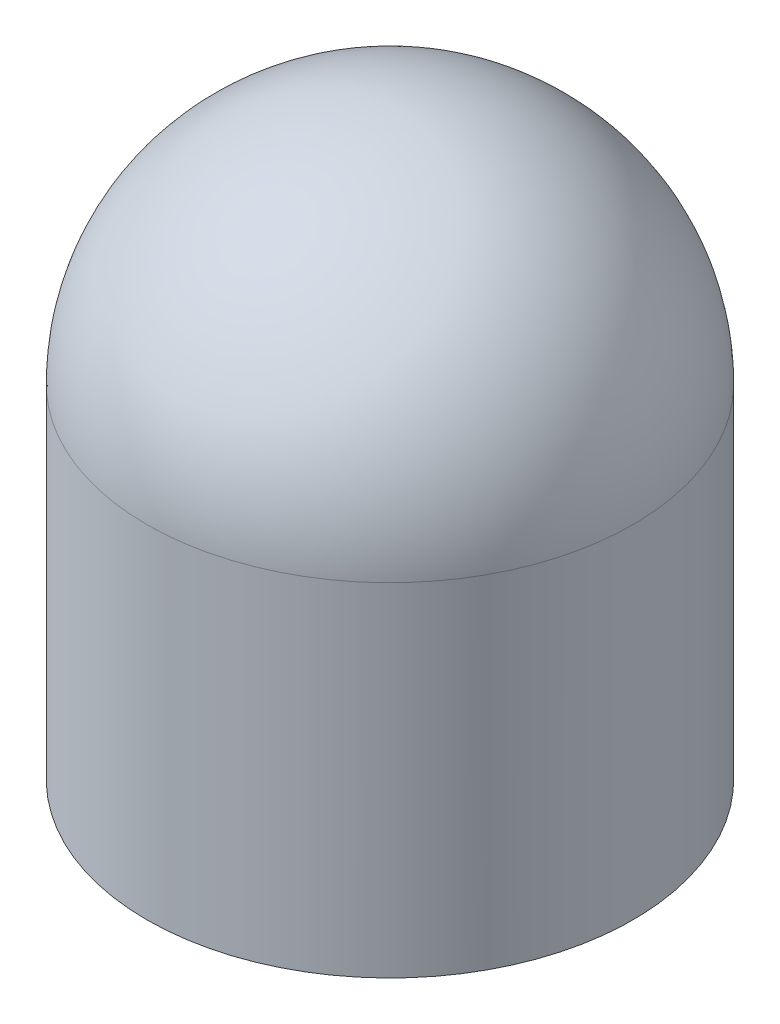
ISO-10303-21;
HEADER;
FILE_DESCRIPTION(('STEP AP214'),'2;1');
FILE_NAME('part.step','',(''),(''),'','','');
FILE_SCHEMA(('AUTOMOTIVE_DESIGN { 1 0 10303 214 1 1 1 1 }'));
ENDSEC;
DATA;
#1=APPLICATION_CONTEXT('core data for automotive mechanical design processes');
#2=APPLICATION_PROTOCOL_DEFINITION('international standard','automotive_design',2000,#1);
#3=PRODUCT_CONTEXT('',#1,'mechanical');
#4=PRODUCT('Part','Part','',(#3));
#5=PRODUCT_RELATED_PRODUCT_CATEGORY('part','',(#4));
#6=PRODUCT_DEFINITION_FORMATION('','',#4);
#7=PRODUCT_DEFINITION_CONTEXT('part definition',#1,'design');
#8=PRODUCT_DEFINITION('design','',#6,#7);
#9=PRODUCT_DEFINITION_SHAPE('','',#8);
#10=(LENGTH_UNIT() NAMED_UNIT(*) SI_UNIT(.MILLI.,.METRE.));
#11=(NAMED_UNIT(*) PLANE_ANGLE_UNIT() SI_UNIT($,.RADIAN.));
#12=(NAMED_UNIT(*) SI_UNIT($,.STERADIAN.) SOLID_ANGLE_UNIT());
#13=UNCERTAINTY_MEASURE_WITH_UNIT(LENGTH_MEASURE(1.E-05),#10,'distance_accuracy_value','');
#14=(GEOMETRIC_REPRESENTATION_CONTEXT(3) GLOBAL_UNCERTAINTY_ASSIGNED_CONTEXT((#13)) GLOBAL_UNIT_ASSIGNED_CONTEXT((#10,
#11,#12)) REPRESENTATION_CONTEXT('',''));
#15=CARTESIAN_POINT('',(0.,0.,0.));
#16=DIRECTION('',(0.,0.,1.));
#17=DIRECTION('',(1.,0.,0.));
#18=AXIS2_PLACEMENT_3D('',#15,#16,#17);
#19=CARTESIAN_POINT('',(1.55431223447522E-12,10.4000000000001,3.5527136788005E-12));
#20=DIRECTION('',(0.,1.,0.));
#21=DIRECTION('',(0.,0.,1.));
#22=AXIS2_PLACEMENT_3D('',#19,#20,#21);
#23=CYLINDRICAL_SURFACE('',#22,10.65);
#24=CARTESIAN_POINT('',(-4.44089209850063E-13,-15.,4.21884749357559E-12));
#25=DIRECTION('',(0.,1.,0.));
#26=DIRECTION('',(0.,0.,1.));
#27=AXIS2_PLACEMENT_3D('',#24,#25,#26);
#28=CIRCLE('',#27,10.65);
#29=CARTESIAN_POINT('',(-4.4349801608945E-13,-15.,10.6500000000042));
#30=VERTEX_POINT('',#29);
#31=EDGE_CURVE('E70',#30,#30,#28,.T.);
#32=ORIENTED_EDGE('',*,*,#31,.T.);
#33=EDGE_LOOP('',(#32));
#34=FACE_BOUND('',#33,.T.);
#35=CARTESIAN_POINT('',(0.,0.,0.));
#36=DIRECTION('',(0.,1.,0.));
#37=DIRECTION('',(0.,0.,1.));
#38=AXIS2_PLACEMENT_3D('',#35,#36,#37);
#39=CIRCLE('',#38,10.65);
#40=CARTESIAN_POINT('',(0.,0.,10.65));
#41=VERTEX_POINT('',#40);
#42=EDGE_CURVE('E11',#41,#41,#39,.T.);
#43=ORIENTED_EDGE('',*,*,#42,.F.);
#44=EDGE_LOOP('',(#43));
#45=FACE_BOUND('',#44,.T.);
#46=ADVANCED_FACE('F34',(#34,#45),#23,.T.);
#47=CARTESIAN_POINT('',(0.,0.,0.));
#48=DIRECTION('',(0.,0.,1.));
#49=DIRECTION('',(-0.999999999999999,0.,0.));
#50=AXIS2_PLACEMENT_3D('',#47,#48,#49);
#51=ELLIPSE('',#50,10.65,10.4);
#52=TRIMMED_CURVE('',#51,(PARAMETER_VALUE(4.71238898038469)),
(PARAMETER_VALUE(7.85398163397448)),.T.,.PARAMETER.);
#53=CARTESIAN_POINT('',(1.55431223447522E-12,10.4000000000001,3.5527136788005E-12));
#54=DIRECTION('',(0.,1.,0.));
#55=AXIS1_PLACEMENT('',#53,#54);
#56=SURFACE_OF_REVOLUTION('',#52,#55);
#57=ORIENTED_EDGE('',*,*,#42,.T.);
#58=EDGE_LOOP('',(#57));
#59=FACE_BOUND('',#58,.T.);
#60=CARTESIAN_POINT('',(1.55431223447522E-12,10.4000000000001,3.5527136788005E-12));
#61=VERTEX_POINT('',#60);
#62=VERTEX_LOOP('',#61);
#63=FACE_BOUND('',#62,.T.);
#64=ADVANCED_FACE('F50',(#59,#63),#56,.F.);
#65=CARTESIAN_POINT('',(1.55431223447522E-12,7.59999999999995,3.99680288865056E-12));
#66=CARTESIAN_POINT('',(-1.03616633286063,7.60000000000012,3.77475828372553E-12));
#67=CARTESIAN_POINT('',(-2.07175097106416,7.39849161421469,3.77475828372553E-12));
#68=CARTESIAN_POINT('',(-3.97953854376332,6.62681016237533,4.66293670342566E-12));
#69=CARTESIAN_POINT('',(-4.85082950111582,6.05726333308616,3.77475828372553E-12));
#70=CARTESIAN_POINT('',(-6.29805136363437,4.64401381476007,4.21884749357559E-12));
#71=CARTESIAN_POINT('',(-6.87365650737926,3.80116868313676,6.66133814775094E-13));
#72=CARTESIAN_POINT('',(-7.64958647302683,1.97188129123535,-8.88178419700125E-13));
#73=CARTESIAN_POINT('',(-7.85000000000213,0.98602711731674,0.));
#74=CARTESIAN_POINT('',(-7.8500000000008,0.,6.66133814775094E-13));
#75=B_SPLINE_CURVE_WITH_KNOTS('',3,(#65,#66,#67,#68,#69,#70,#71,#72,#73,#74),.UNSPECIFIED.,.F.,
.F.,(4,2,2,2,4),(0.,0.25,0.5,0.75,1.),.UNSPECIFIED.);
#76=CARTESIAN_POINT('',(1.55431223447522E-12,10.4000000000001,3.5527136788005E-12));
#77=DIRECTION('',(0.,1.,0.));
#78=AXIS1_PLACEMENT('',#76,#77);
#79=SURFACE_OF_REVOLUTION('',#75,#78);
#80=CARTESIAN_POINT('',(0.,0.,0.));
#81=DIRECTION('',(0.,1.,0.));
#82=DIRECTION('',(0.,0.,1.));
#83=AXIS2_PLACEMENT_3D('',#80,#81,#82);
#84=CIRCLE('',#83,7.85);
#85=CARTESIAN_POINT('',(0.,0.,7.85000000000002));
#86=VERTEX_POINT('',#85);
#87=EDGE_CURVE('E41',#86,#86,#84,.T.);
#88=ORIENTED_EDGE('',*,*,#87,.F.);
#89=EDGE_LOOP('',(#88));
#90=FACE_BOUND('',#89,.T.);
#91=CARTESIAN_POINT('',(1.55431223447522E-12,7.59999999999995,3.99680288865056E-12));
#92=VERTEX_POINT('',#91);
#93=VERTEX_LOOP('',#92);
#94=FACE_BOUND('',#93,.T.);
#95=ADVANCED_FACE('F47',(#90,#94),#79,.T.);
#96=CARTESIAN_POINT('',(1.55431223447522E-12,10.4000000000001,3.5527136788005E-12));
#97=DIRECTION('',(0.,1.,0.));
#98=DIRECTION('',(0.,0.,1.));
#99=AXIS2_PLACEMENT_3D('',#96,#97,#98);
#100=CYLINDRICAL_SURFACE('',#99,7.85);
#101=CARTESIAN_POINT('',(-4.44089209850063E-13,-15.,4.21884749357559E-12));
#102=DIRECTION('',(0.,1.,0.));
#103=DIRECTION('',(0.,0.,1.));
#104=AXIS2_PLACEMENT_3D('',#101,#102,#103);
#105=CIRCLE('',#104,7.85);
#106=CARTESIAN_POINT('',(-4.43653447312897E-13,-15.,7.85000000000424));
#107=VERTEX_POINT('',#106);
#108=EDGE_CURVE('E73',#107,#107,#105,.T.);
#109=ORIENTED_EDGE('',*,*,#108,.F.);
#110=EDGE_LOOP('',(#109));
#111=FACE_BOUND('',#110,.T.);
#112=ORIENTED_EDGE('',*,*,#87,.T.);
#113=EDGE_LOOP('',(#112));
#114=FACE_BOUND('',#113,.T.);
#115=ADVANCED_FACE('F49',(#111,#114),#100,.F.);
#116=CARTESIAN_POINT('',(-7.85000000000124,-14.9999999999999,4.66293670342566E-12));
#117=DIRECTION('',(0.,1.,0.));
#118=DIRECTION('',(0.,0.,1.));
#119=AXIS2_PLACEMENT_3D('',#116,#117,#118);
#120=PLANE('',#119);
#121=ORIENTED_EDGE('',*,*,#31,.F.);
#122=EDGE_LOOP('',(#121));
#123=FACE_BOUND('',#122,.T.);
#124=ORIENTED_EDGE('',*,*,#108,.T.);
#125=EDGE_LOOP('',(#124));
#126=FACE_BOUND('',#125,.T.);
#127=ADVANCED_FACE('F57',(#123,#126),#120,.F.);
#128=CLOSED_SHELL('',(#46,#64,#95,#115,#127));
#129=MANIFOLD_SOLID_BREP('B2',#128);
#130=ADVANCED_BREP_SHAPE_REPRESENTATION('',(#18,#129),#14);
#131=SHAPE_DEFINITION_REPRESENTATION(#9,#130);
ENDSEC;
END-ISO-10303-21;
